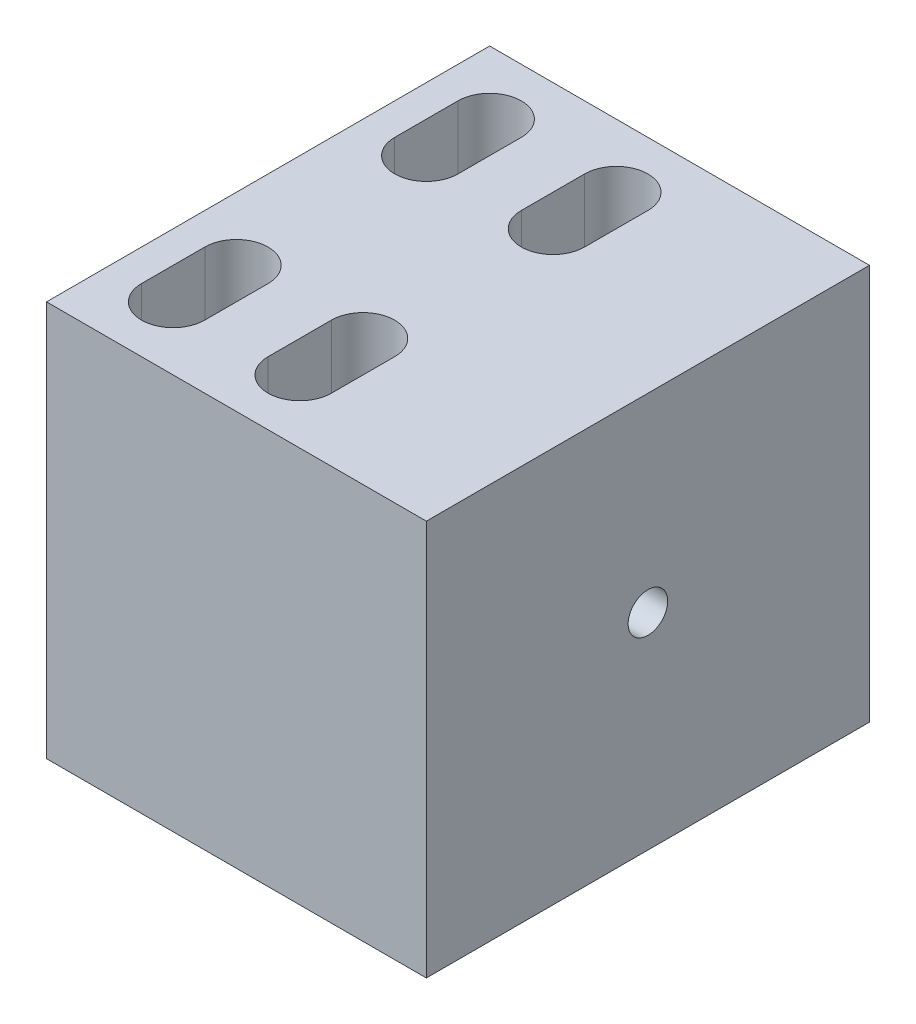
ISO-10303-21;
HEADER;
FILE_DESCRIPTION(('STEP AP214'),'2;1');
FILE_NAME('part.step','',(''),(''),'','','');
FILE_SCHEMA(('AUTOMOTIVE_DESIGN { 1 0 10303 214 1 1 1 1 }'));
ENDSEC;
DATA;
#1=APPLICATION_CONTEXT('core data for automotive mechanical design processes');
#2=APPLICATION_PROTOCOL_DEFINITION('international standard','automotive_design',2000,#1);
#3=PRODUCT_CONTEXT('',#1,'mechanical');
#4=PRODUCT('Part','Part','',(#3));
#5=PRODUCT_RELATED_PRODUCT_CATEGORY('part','',(#4));
#6=PRODUCT_DEFINITION_FORMATION('','',#4);
#7=PRODUCT_DEFINITION_CONTEXT('part definition',#1,'design');
#8=PRODUCT_DEFINITION('design','',#6,#7);
#9=PRODUCT_DEFINITION_SHAPE('','',#8);
#10=(LENGTH_UNIT() NAMED_UNIT(*) SI_UNIT(.MILLI.,.METRE.));
#11=(NAMED_UNIT(*) PLANE_ANGLE_UNIT() SI_UNIT($,.RADIAN.));
#12=(NAMED_UNIT(*) SI_UNIT($,.STERADIAN.) SOLID_ANGLE_UNIT());
#13=UNCERTAINTY_MEASURE_WITH_UNIT(LENGTH_MEASURE(1.E-05),#10,'distance_accuracy_value','');
#14=(GEOMETRIC_REPRESENTATION_CONTEXT(3) GLOBAL_UNCERTAINTY_ASSIGNED_CONTEXT((#13)) GLOBAL_UNIT_ASSIGNED_CONTEXT((#10,
#11,#12)) REPRESENTATION_CONTEXT('',''));
#15=CARTESIAN_POINT('',(0.,0.,0.));
#16=DIRECTION('',(0.,0.,1.));
#17=DIRECTION('',(1.,0.,0.));
#18=AXIS2_PLACEMENT_3D('',#15,#16,#17);
#19=CARTESIAN_POINT('',(0.,25.,0.));
#20=DIRECTION('',(-1.,0.,0.));
#21=DIRECTION('',(0.,0.,1.));
#22=AXIS2_PLACEMENT_3D('',#19,#20,#21);
#23=PLANE('',#22);
#24=CARTESIAN_POINT('',(0.,13.,-14.));
#25=DIRECTION('',(1.,0.,0.));
#26=DIRECTION('',(0.,0.,-1.));
#27=AXIS2_PLACEMENT_3D('',#24,#25,#26);
#28=CIRCLE('',#27,1.25);
#29=CARTESIAN_POINT('',(0.,13.,-15.25));
#30=VERTEX_POINT('',#29);
#31=EDGE_CURVE('E249',#30,#30,#28,.T.);
#32=ORIENTED_EDGE('',*,*,#31,.T.);
#33=EDGE_LOOP('',(#32));
#34=FACE_BOUND('',#33,.T.);
#35=DIRECTION('',(0.,0.,-1.));
#36=VECTOR('',#35,1.);
#37=CARTESIAN_POINT('',(0.,0.,0.));
#38=LINE('',#37,#36);
#39=CARTESIAN_POINT('',(0.,0.,0.));
#40=VERTEX_POINT('',#39);
#41=CARTESIAN_POINT('',(0.,0.,-28.));
#42=VERTEX_POINT('',#41);
#43=EDGE_CURVE('E295',#40,#42,#38,.T.);
#44=ORIENTED_EDGE('',*,*,#43,.F.);
#45=DIRECTION('',(0.,-1.,0.));
#46=VECTOR('',#45,1.);
#47=CARTESIAN_POINT('',(0.,25.,0.));
#48=LINE('',#47,#46);
#49=CARTESIAN_POINT('',(0.,25.,0.));
#50=VERTEX_POINT('',#49);
#51=EDGE_CURVE('E11',#50,#40,#48,.T.);
#52=ORIENTED_EDGE('',*,*,#51,.F.);
#53=DIRECTION('',(0.,0.,-1.));
#54=VECTOR('',#53,1.);
#55=CARTESIAN_POINT('',(0.,25.,0.));
#56=LINE('',#55,#54);
#57=CARTESIAN_POINT('',(0.,25.,-28.));
#58=VERTEX_POINT('',#57);
#59=EDGE_CURVE('E190',#50,#58,#56,.T.);
#60=ORIENTED_EDGE('',*,*,#59,.T.);
#61=DIRECTION('',(0.,-1.,0.));
#62=VECTOR('',#61,1.);
#63=CARTESIAN_POINT('',(0.,25.,-28.));
#64=LINE('',#63,#62);
#65=EDGE_CURVE('E52',#58,#42,#64,.T.);
#66=ORIENTED_EDGE('',*,*,#65,.T.);
#67=EDGE_LOOP('',(#44,#52,#60,#66));
#68=FACE_BOUND('',#67,.T.);
#69=ADVANCED_FACE('F33',(#34,#68),#23,.T.);
#70=CARTESIAN_POINT('',(0.,25.,0.));
#71=DIRECTION('',(0.,0.,-1.));
#72=DIRECTION('',(-1.,0.,0.));
#73=AXIS2_PLACEMENT_3D('',#70,#71,#72);
#74=PLANE('',#73);
#75=DIRECTION('',(1.,0.,0.));
#76=VECTOR('',#75,1.);
#77=CARTESIAN_POINT('',(0.,0.,0.));
#78=LINE('',#77,#76);
#79=CARTESIAN_POINT('',(24.,0.,0.));
#80=VERTEX_POINT('',#79);
#81=EDGE_CURVE('E195',#40,#80,#78,.T.);
#82=ORIENTED_EDGE('',*,*,#81,.T.);
#83=DIRECTION('',(0.,-1.,0.));
#84=VECTOR('',#83,1.);
#85=CARTESIAN_POINT('',(24.,25.,0.));
#86=LINE('',#85,#84);
#87=CARTESIAN_POINT('',(24.,25.,0.));
#88=VERTEX_POINT('',#87);
#89=EDGE_CURVE('E43',#88,#80,#86,.T.);
#90=ORIENTED_EDGE('',*,*,#89,.F.);
#91=DIRECTION('',(1.,0.,0.));
#92=VECTOR('',#91,1.);
#93=CARTESIAN_POINT('',(0.,25.,0.));
#94=LINE('',#93,#92);
#95=EDGE_CURVE('E185',#50,#88,#94,.T.);
#96=ORIENTED_EDGE('',*,*,#95,.F.);
#97=ORIENTED_EDGE('',*,*,#51,.T.);
#98=EDGE_LOOP('',(#82,#90,#96,#97));
#99=FACE_BOUND('',#98,.T.);
#100=ADVANCED_FACE('F193',(#99),#74,.F.);
#101=CARTESIAN_POINT('',(24.,25.,0.));
#102=DIRECTION('',(-1.,0.,0.));
#103=DIRECTION('',(0.,0.,1.));
#104=AXIS2_PLACEMENT_3D('',#101,#102,#103);
#105=PLANE('',#104);
#106=CARTESIAN_POINT('',(24.,13.,-14.));
#107=DIRECTION('',(1.,0.,0.));
#108=DIRECTION('',(0.,0.,-1.));
#109=AXIS2_PLACEMENT_3D('',#106,#107,#108);
#110=CIRCLE('',#109,1.25);
#111=CARTESIAN_POINT('',(24.,13.,-15.25));
#112=VERTEX_POINT('',#111);
#113=EDGE_CURVE('E252',#112,#112,#110,.T.);
#114=ORIENTED_EDGE('',*,*,#113,.F.);
#115=EDGE_LOOP('',(#114));
#116=FACE_BOUND('',#115,.T.);
#117=DIRECTION('',(0.,0.,-1.));
#118=VECTOR('',#117,1.);
#119=CARTESIAN_POINT('',(24.,0.,0.));
#120=LINE('',#119,#118);
#121=CARTESIAN_POINT('',(24.,0.,-28.));
#122=VERTEX_POINT('',#121);
#123=EDGE_CURVE('E298',#80,#122,#120,.T.);
#124=ORIENTED_EDGE('',*,*,#123,.T.);
#125=DIRECTION('',(0.,-1.,0.));
#126=VECTOR('',#125,1.);
#127=CARTESIAN_POINT('',(24.,25.,-28.));
#128=LINE('',#127,#126);
#129=CARTESIAN_POINT('',(24.,25.,-28.));
#130=VERTEX_POINT('',#129);
#131=EDGE_CURVE('E114',#130,#122,#128,.T.);
#132=ORIENTED_EDGE('',*,*,#131,.F.);
#133=DIRECTION('',(0.,0.,-1.));
#134=VECTOR('',#133,1.);
#135=CARTESIAN_POINT('',(24.,25.,0.));
#136=LINE('',#135,#134);
#137=EDGE_CURVE('E177',#88,#130,#136,.T.);
#138=ORIENTED_EDGE('',*,*,#137,.F.);
#139=ORIENTED_EDGE('',*,*,#89,.T.);
#140=EDGE_LOOP('',(#124,#132,#138,#139));
#141=FACE_BOUND('',#140,.T.);
#142=ADVANCED_FACE('F179',(#116,#141),#105,.F.);
#143=CARTESIAN_POINT('',(12.,25.,-8.));
#144=DIRECTION('',(0.,-1.,0.));
#145=DIRECTION('',(0.,0.,-1.));
#146=AXIS2_PLACEMENT_3D('',#143,#144,#145);
#147=CYLINDRICAL_SURFACE('',#146,2.);
#148=CARTESIAN_POINT('',(12.,0.,-8.));
#149=DIRECTION('',(0.,1.,0.));
#150=DIRECTION('',(0.,0.,1.));
#151=AXIS2_PLACEMENT_3D('',#148,#149,#150);
#152=CIRCLE('',#151,2.);
#153=CARTESIAN_POINT('',(14.,0.,-8.));
#154=VERTEX_POINT('',#153);
#155=CARTESIAN_POINT('',(10.,0.,-8.));
#156=VERTEX_POINT('',#155);
#157=EDGE_CURVE('E283',#154,#156,#152,.T.);
#158=ORIENTED_EDGE('',*,*,#157,.F.);
#159=DIRECTION('',(0.,-1.,0.));
#160=VECTOR('',#159,1.);
#161=CARTESIAN_POINT('',(14.,25.,-8.));
#162=LINE('',#161,#160);
#163=CARTESIAN_POINT('',(14.,25.,-8.));
#164=VERTEX_POINT('',#163);
#165=EDGE_CURVE('E207',#164,#154,#162,.T.);
#166=ORIENTED_EDGE('',*,*,#165,.F.);
#167=CARTESIAN_POINT('',(12.,25.,-8.));
#168=DIRECTION('',(0.,1.,0.));
#169=DIRECTION('',(0.,0.,1.));
#170=AXIS2_PLACEMENT_3D('',#167,#168,#169);
#171=CIRCLE('',#170,2.);
#172=CARTESIAN_POINT('',(10.,25.,-8.));
#173=VERTEX_POINT('',#172);
#174=EDGE_CURVE('E336',#164,#173,#171,.T.);
#175=ORIENTED_EDGE('',*,*,#174,.T.);
#176=DIRECTION('',(0.,-1.,0.));
#177=VECTOR('',#176,1.);
#178=CARTESIAN_POINT('',(10.,25.,-8.));
#179=LINE('',#178,#177);
#180=EDGE_CURVE('E200',#173,#156,#179,.T.);
#181=ORIENTED_EDGE('',*,*,#180,.T.);
#182=EDGE_LOOP('',(#158,#166,#175,#181));
#183=FACE_BOUND('',#182,.T.);
#184=ADVANCED_FACE('F384',(#183),#147,.F.);
#185=CARTESIAN_POINT('',(14.,25.,0.));
#186=DIRECTION('',(-1.,0.,0.));
#187=DIRECTION('',(0.,0.,1.));
#188=AXIS2_PLACEMENT_3D('',#185,#186,#187);
#189=PLANE('',#188);
#190=DIRECTION('',(0.,0.,-1.));
#191=VECTOR('',#190,1.);
#192=CARTESIAN_POINT('',(14.,0.,0.));
#193=LINE('',#192,#191);
#194=CARTESIAN_POINT('',(14.,0.,-4.));
#195=VERTEX_POINT('',#194);
#196=EDGE_CURVE('E286',#195,#154,#193,.T.);
#197=ORIENTED_EDGE('',*,*,#196,.F.);
#198=DIRECTION('',(0.,-1.,0.));
#199=VECTOR('',#198,1.);
#200=CARTESIAN_POINT('',(14.,25.,-4.));
#201=LINE('',#200,#199);
#202=CARTESIAN_POINT('',(14.,25.,-4.));
#203=VERTEX_POINT('',#202);
#204=EDGE_CURVE('E205',#203,#195,#201,.T.);
#205=ORIENTED_EDGE('',*,*,#204,.F.);
#206=DIRECTION('',(0.,0.,-1.));
#207=VECTOR('',#206,1.);
#208=CARTESIAN_POINT('',(14.,25.,0.));
#209=LINE('',#208,#207);
#210=EDGE_CURVE('E339',#203,#164,#209,.T.);
#211=ORIENTED_EDGE('',*,*,#210,.T.);
#212=ORIENTED_EDGE('',*,*,#165,.T.);
#213=EDGE_LOOP('',(#197,#205,#211,#212));
#214=FACE_BOUND('',#213,.T.);
#215=ADVANCED_FACE('F380',(#214),#189,.T.);
#216=CARTESIAN_POINT('',(12.,25.,-4.));
#217=DIRECTION('',(0.,-1.,0.));
#218=DIRECTION('',(0.,0.,-1.));
#219=AXIS2_PLACEMENT_3D('',#216,#217,#218);
#220=CYLINDRICAL_SURFACE('',#219,2.);
#221=CARTESIAN_POINT('',(12.,0.,-4.));
#222=DIRECTION('',(0.,1.,0.));
#223=DIRECTION('',(0.,0.,1.));
#224=AXIS2_PLACEMENT_3D('',#221,#222,#223);
#225=CIRCLE('',#224,2.);
#226=CARTESIAN_POINT('',(10.,0.,-4.));
#227=VERTEX_POINT('',#226);
#228=EDGE_CURVE('E289',#227,#195,#225,.T.);
#229=ORIENTED_EDGE('',*,*,#228,.F.);
#230=DIRECTION('',(0.,-1.,0.));
#231=VECTOR('',#230,1.);
#232=CARTESIAN_POINT('',(10.,25.,-4.));
#233=LINE('',#232,#231);
#234=CARTESIAN_POINT('',(10.,25.,-4.));
#235=VERTEX_POINT('',#234);
#236=EDGE_CURVE('E202',#235,#227,#233,.T.);
#237=ORIENTED_EDGE('',*,*,#236,.F.);
#238=CARTESIAN_POINT('',(12.,25.,-4.));
#239=DIRECTION('',(0.,1.,0.));
#240=DIRECTION('',(0.,0.,1.));
#241=AXIS2_PLACEMENT_3D('',#238,#239,#240);
#242=CIRCLE('',#241,2.);
#243=EDGE_CURVE('E342',#235,#203,#242,.T.);
#244=ORIENTED_EDGE('',*,*,#243,.T.);
#245=ORIENTED_EDGE('',*,*,#204,.T.);
#246=EDGE_LOOP('',(#229,#237,#244,#245));
#247=FACE_BOUND('',#246,.T.);
#248=ADVANCED_FACE('F376',(#247),#220,.F.);
#249=CARTESIAN_POINT('',(11.9999999999999,25.,-24.));
#250=DIRECTION('',(0.,-1.,0.));
#251=DIRECTION('',(0.,0.,-1.));
#252=AXIS2_PLACEMENT_3D('',#249,#250,#251);
#253=CYLINDRICAL_SURFACE('',#252,2.00000000000006);
#254=CARTESIAN_POINT('',(11.9999999999999,0.,-24.));
#255=DIRECTION('',(0.,1.,0.));
#256=DIRECTION('',(0.,0.,1.));
#257=AXIS2_PLACEMENT_3D('',#254,#255,#256);
#258=CIRCLE('',#257,2.00000000000006);
#259=CARTESIAN_POINT('',(14.0000000000001,0.,-24.));
#260=VERTEX_POINT('',#259);
#261=CARTESIAN_POINT('',(9.99999999999994,0.,-24.));
#262=VERTEX_POINT('',#261);
#263=EDGE_CURVE('E271',#260,#262,#258,.T.);
#264=ORIENTED_EDGE('',*,*,#263,.F.);
#265=DIRECTION('',(0.,-1.,0.));
#266=VECTOR('',#265,1.);
#267=CARTESIAN_POINT('',(14.0000000000001,25.,-24.));
#268=LINE('',#267,#266);
#269=CARTESIAN_POINT('',(14.0000000000001,25.,-24.));
#270=VERTEX_POINT('',#269);
#271=EDGE_CURVE('E203',#270,#260,#268,.T.);
#272=ORIENTED_EDGE('',*,*,#271,.F.);
#273=CARTESIAN_POINT('',(11.9999999999999,25.,-24.));
#274=DIRECTION('',(0.,1.,0.));
#275=DIRECTION('',(0.,0.,1.));
#276=AXIS2_PLACEMENT_3D('',#273,#274,#275);
#277=CIRCLE('',#276,2.00000000000006);
#278=CARTESIAN_POINT('',(9.99999999999994,25.,-24.));
#279=VERTEX_POINT('',#278);
#280=EDGE_CURVE('E325',#270,#279,#277,.T.);
#281=ORIENTED_EDGE('',*,*,#280,.T.);
#282=DIRECTION('',(0.,-1.,0.));
#283=VECTOR('',#282,1.);
#284=CARTESIAN_POINT('',(9.99999999999994,25.,-24.));
#285=LINE('',#284,#283);
#286=EDGE_CURVE('E209',#279,#262,#285,.T.);
#287=ORIENTED_EDGE('',*,*,#286,.T.);
#288=EDGE_LOOP('',(#264,#272,#281,#287));
#289=FACE_BOUND('',#288,.T.);
#290=ADVANCED_FACE('F379',(#289),#253,.F.);
#291=CARTESIAN_POINT('',(14.0000000000001,25.,0.));
#292=DIRECTION('',(-1.,0.,0.));
#293=DIRECTION('',(0.,0.,1.));
#294=AXIS2_PLACEMENT_3D('',#291,#292,#293);
#295=PLANE('',#294);
#296=DIRECTION('',(0.,0.,-1.));
#297=VECTOR('',#296,1.);
#298=CARTESIAN_POINT('',(14.0000000000001,0.,0.));
#299=LINE('',#298,#297);
#300=CARTESIAN_POINT('',(14.0000000000001,0.,-20.));
#301=VERTEX_POINT('',#300);
#302=EDGE_CURVE('E274',#301,#260,#299,.T.);
#303=ORIENTED_EDGE('',*,*,#302,.F.);
#304=DIRECTION('',(0.,-1.,0.));
#305=VECTOR('',#304,1.);
#306=CARTESIAN_POINT('',(14.0000000000001,25.,-20.));
#307=LINE('',#306,#305);
#308=CARTESIAN_POINT('',(14.0000000000001,25.,-20.));
#309=VERTEX_POINT('',#308);
#310=EDGE_CURVE('E214',#309,#301,#307,.T.);
#311=ORIENTED_EDGE('',*,*,#310,.F.);
#312=DIRECTION('',(0.,0.,-1.));
#313=VECTOR('',#312,1.);
#314=CARTESIAN_POINT('',(14.0000000000001,25.,0.));
#315=LINE('',#314,#313);
#316=EDGE_CURVE('E328',#309,#270,#315,.T.);
#317=ORIENTED_EDGE('',*,*,#316,.T.);
#318=ORIENTED_EDGE('',*,*,#271,.T.);
#319=EDGE_LOOP('',(#303,#311,#317,#318));
#320=FACE_BOUND('',#319,.T.);
#321=ADVANCED_FACE('F396',(#320),#295,.T.);
#322=CARTESIAN_POINT('',(11.9999999999999,25.,-20.));
#323=DIRECTION('',(0.,-1.,0.));
#324=DIRECTION('',(0.,0.,-1.));
#325=AXIS2_PLACEMENT_3D('',#322,#323,#324);
#326=CYLINDRICAL_SURFACE('',#325,2.00000000000006);
#327=CARTESIAN_POINT('',(11.9999999999999,0.,-20.));
#328=DIRECTION('',(0.,1.,0.));
#329=DIRECTION('',(0.,0.,1.));
#330=AXIS2_PLACEMENT_3D('',#327,#328,#329);
#331=CIRCLE('',#330,2.00000000000006);
#332=CARTESIAN_POINT('',(9.99999999999994,0.,-20.));
#333=VERTEX_POINT('',#332);
#334=EDGE_CURVE('E277',#333,#301,#331,.T.);
#335=ORIENTED_EDGE('',*,*,#334,.F.);
#336=DIRECTION('',(0.,-1.,0.));
#337=VECTOR('',#336,1.);
#338=CARTESIAN_POINT('',(9.99999999999994,25.,-20.));
#339=LINE('',#338,#337);
#340=CARTESIAN_POINT('',(9.99999999999994,25.,-20.));
#341=VERTEX_POINT('',#340);
#342=EDGE_CURVE('E211',#341,#333,#339,.T.);
#343=ORIENTED_EDGE('',*,*,#342,.F.);
#344=CARTESIAN_POINT('',(11.9999999999999,25.,-20.));
#345=DIRECTION('',(0.,1.,0.));
#346=DIRECTION('',(0.,0.,1.));
#347=AXIS2_PLACEMENT_3D('',#344,#345,#346);
#348=CIRCLE('',#347,2.00000000000006);
#349=EDGE_CURVE('E331',#341,#309,#348,.T.);
#350=ORIENTED_EDGE('',*,*,#349,.T.);
#351=ORIENTED_EDGE('',*,*,#310,.T.);
#352=EDGE_LOOP('',(#335,#343,#350,#351));
#353=FACE_BOUND('',#352,.T.);
#354=ADVANCED_FACE('F392',(#353),#326,.F.);
#355=CARTESIAN_POINT('',(3.99999999999994,25.,-24.));
#356=DIRECTION('',(0.,-1.,0.));
#357=DIRECTION('',(0.,0.,-1.));
#358=AXIS2_PLACEMENT_3D('',#355,#356,#357);
#359=CYLINDRICAL_SURFACE('',#358,2.00000000000006);
#360=CARTESIAN_POINT('',(3.99999999999994,0.,-24.));
#361=DIRECTION('',(0.,1.,0.));
#362=DIRECTION('',(0.,0.,1.));
#363=AXIS2_PLACEMENT_3D('',#360,#361,#362);
#364=CIRCLE('',#363,2.00000000000006);
#365=CARTESIAN_POINT('',(6.00000000000006,0.,-24.));
#366=VERTEX_POINT('',#365);
#367=CARTESIAN_POINT('',(1.99999999999994,0.,-24.));
#368=VERTEX_POINT('',#367);
#369=EDGE_CURVE('E259',#366,#368,#364,.T.);
#370=ORIENTED_EDGE('',*,*,#369,.F.);
#371=DIRECTION('',(0.,-1.,0.));
#372=VECTOR('',#371,1.);
#373=CARTESIAN_POINT('',(6.00000000000006,25.,-24.));
#374=LINE('',#373,#372);
#375=CARTESIAN_POINT('',(6.00000000000006,25.,-24.));
#376=VERTEX_POINT('',#375);
#377=EDGE_CURVE('E212',#376,#366,#374,.T.);
#378=ORIENTED_EDGE('',*,*,#377,.F.);
#379=CARTESIAN_POINT('',(3.99999999999994,25.,-24.));
#380=DIRECTION('',(0.,1.,0.));
#381=DIRECTION('',(0.,0.,1.));
#382=AXIS2_PLACEMENT_3D('',#379,#380,#381);
#383=CIRCLE('',#382,2.00000000000006);
#384=CARTESIAN_POINT('',(1.99999999999994,25.,-24.));
#385=VERTEX_POINT('',#384);
#386=EDGE_CURVE('E314',#376,#385,#383,.T.);
#387=ORIENTED_EDGE('',*,*,#386,.T.);
#388=DIRECTION('',(0.,-1.,0.));
#389=VECTOR('',#388,1.);
#390=CARTESIAN_POINT('',(1.99999999999994,25.,-24.));
#391=LINE('',#390,#389);
#392=EDGE_CURVE('E217',#385,#368,#391,.T.);
#393=ORIENTED_EDGE('',*,*,#392,.T.);
#394=EDGE_LOOP('',(#370,#378,#387,#393));
#395=FACE_BOUND('',#394,.T.);
#396=ADVANCED_FACE('F395',(#395),#359,.F.);
#397=CARTESIAN_POINT('',(6.00000000000006,25.,0.));
#398=DIRECTION('',(-1.,0.,0.));
#399=DIRECTION('',(0.,0.,1.));
#400=AXIS2_PLACEMENT_3D('',#397,#398,#399);
#401=PLANE('',#400);
#402=DIRECTION('',(0.,0.,-1.));
#403=VECTOR('',#402,1.);
#404=CARTESIAN_POINT('',(6.00000000000006,0.,0.));
#405=LINE('',#404,#403);
#406=CARTESIAN_POINT('',(6.00000000000006,0.,-20.));
#407=VERTEX_POINT('',#406);
#408=EDGE_CURVE('E262',#407,#366,#405,.T.);
#409=ORIENTED_EDGE('',*,*,#408,.F.);
#410=DIRECTION('',(0.,-1.,0.));
#411=VECTOR('',#410,1.);
#412=CARTESIAN_POINT('',(6.00000000000006,25.,-20.));
#413=LINE('',#412,#411);
#414=CARTESIAN_POINT('',(6.00000000000006,25.,-20.));
#415=VERTEX_POINT('',#414);
#416=EDGE_CURVE('E221',#415,#407,#413,.T.);
#417=ORIENTED_EDGE('',*,*,#416,.F.);
#418=DIRECTION('',(0.,0.,-1.));
#419=VECTOR('',#418,1.);
#420=CARTESIAN_POINT('',(6.00000000000006,25.,0.));
#421=LINE('',#420,#419);
#422=EDGE_CURVE('E317',#415,#376,#421,.T.);
#423=ORIENTED_EDGE('',*,*,#422,.T.);
#424=ORIENTED_EDGE('',*,*,#377,.T.);
#425=EDGE_LOOP('',(#409,#417,#423,#424));
#426=FACE_BOUND('',#425,.T.);
#427=ADVANCED_FACE('F410',(#426),#401,.T.);
#428=CARTESIAN_POINT('',(3.99999999999994,25.,-20.));
#429=DIRECTION('',(0.,-1.,0.));
#430=DIRECTION('',(0.,0.,-1.));
#431=AXIS2_PLACEMENT_3D('',#428,#429,#430);
#432=CYLINDRICAL_SURFACE('',#431,2.00000000000006);
#433=CARTESIAN_POINT('',(3.99999999999994,0.,-20.));
#434=DIRECTION('',(0.,1.,0.));
#435=DIRECTION('',(0.,0.,1.));
#436=AXIS2_PLACEMENT_3D('',#433,#434,#435);
#437=CIRCLE('',#436,2.00000000000006);
#438=CARTESIAN_POINT('',(1.99999999999994,0.,-20.));
#439=VERTEX_POINT('',#438);
#440=EDGE_CURVE('E265',#439,#407,#437,.T.);
#441=ORIENTED_EDGE('',*,*,#440,.F.);
#442=DIRECTION('',(0.,-1.,0.));
#443=VECTOR('',#442,1.);
#444=CARTESIAN_POINT('',(1.99999999999994,25.,-20.));
#445=LINE('',#444,#443);
#446=CARTESIAN_POINT('',(1.99999999999994,25.,-20.));
#447=VERTEX_POINT('',#446);
#448=EDGE_CURVE('E219',#447,#439,#445,.T.);
#449=ORIENTED_EDGE('',*,*,#448,.F.);
#450=CARTESIAN_POINT('',(3.99999999999994,25.,-20.));
#451=DIRECTION('',(0.,1.,0.));
#452=DIRECTION('',(0.,0.,1.));
#453=AXIS2_PLACEMENT_3D('',#450,#451,#452);
#454=CIRCLE('',#453,2.00000000000006);
#455=EDGE_CURVE('E320',#447,#415,#454,.T.);
#456=ORIENTED_EDGE('',*,*,#455,.T.);
#457=ORIENTED_EDGE('',*,*,#416,.T.);
#458=EDGE_LOOP('',(#441,#449,#456,#457));
#459=FACE_BOUND('',#458,.T.);
#460=ADVANCED_FACE('F407',(#459),#432,.F.);
#461=CARTESIAN_POINT('',(4.,25.,-4.));
#462=DIRECTION('',(0.,-1.,0.));
#463=DIRECTION('',(0.,0.,-1.));
#464=AXIS2_PLACEMENT_3D('',#461,#462,#463);
#465=CYLINDRICAL_SURFACE('',#464,2.);
#466=CARTESIAN_POINT('',(4.,0.,-4.));
#467=DIRECTION('',(0.,1.,0.));
#468=DIRECTION('',(0.,0.,1.));
#469=AXIS2_PLACEMENT_3D('',#466,#467,#468);
#470=CIRCLE('',#469,2.);
#471=CARTESIAN_POINT('',(2.,0.,-4.));
#472=VERTEX_POINT('',#471);
#473=CARTESIAN_POINT('',(6.,0.,-4.));
#474=VERTEX_POINT('',#473);
#475=EDGE_CURVE('E245',#472,#474,#470,.T.);
#476=ORIENTED_EDGE('',*,*,#475,.F.);
#477=DIRECTION('',(0.,-1.,0.));
#478=VECTOR('',#477,1.);
#479=CARTESIAN_POINT('',(2.,25.,-4.));
#480=LINE('',#479,#478);
#481=CARTESIAN_POINT('',(2.,25.,-4.));
#482=VERTEX_POINT('',#481);
#483=EDGE_CURVE('E37',#482,#472,#480,.T.);
#484=ORIENTED_EDGE('',*,*,#483,.F.);
#485=CARTESIAN_POINT('',(4.,25.,-4.));
#486=DIRECTION('',(0.,1.,0.));
#487=DIRECTION('',(0.,0.,1.));
#488=AXIS2_PLACEMENT_3D('',#485,#486,#487);
#489=CIRCLE('',#488,2.);
#490=CARTESIAN_POINT('',(6.,25.,-4.));
#491=VERTEX_POINT('',#490);
#492=EDGE_CURVE('E302',#482,#491,#489,.T.);
#493=ORIENTED_EDGE('',*,*,#492,.T.);
#494=DIRECTION('',(0.,-1.,0.));
#495=VECTOR('',#494,1.);
#496=CARTESIAN_POINT('',(6.,25.,-4.));
#497=LINE('',#496,#495);
#498=EDGE_CURVE('E224',#491,#474,#497,.T.);
#499=ORIENTED_EDGE('',*,*,#498,.T.);
#500=EDGE_LOOP('',(#476,#484,#493,#499));
#501=FACE_BOUND('',#500,.T.);
#502=ADVANCED_FACE('F35',(#501),#465,.F.);
#503=CARTESIAN_POINT('',(2.,25.,0.));
#504=DIRECTION('',(-1.,0.,0.));
#505=DIRECTION('',(0.,0.,1.));
#506=AXIS2_PLACEMENT_3D('',#503,#504,#505);
#507=PLANE('',#506);
#508=DIRECTION('',(0.,0.,-1.));
#509=VECTOR('',#508,1.);
#510=CARTESIAN_POINT('',(2.,0.,0.));
#511=LINE('',#510,#509);
#512=CARTESIAN_POINT('',(2.,0.,-8.));
#513=VERTEX_POINT('',#512);
#514=EDGE_CURVE('E236',#472,#513,#511,.T.);
#515=ORIENTED_EDGE('',*,*,#514,.T.);
#516=DIRECTION('',(0.,-1.,0.));
#517=VECTOR('',#516,1.);
#518=CARTESIAN_POINT('',(2.,25.,-8.));
#519=LINE('',#518,#517);
#520=CARTESIAN_POINT('',(2.,25.,-8.));
#521=VERTEX_POINT('',#520);
#522=EDGE_CURVE('E227',#521,#513,#519,.T.);
#523=ORIENTED_EDGE('',*,*,#522,.F.);
#524=DIRECTION('',(0.,0.,-1.));
#525=VECTOR('',#524,1.);
#526=CARTESIAN_POINT('',(2.,25.,0.));
#527=LINE('',#526,#525);
#528=EDGE_CURVE('E238',#482,#521,#527,.T.);
#529=ORIENTED_EDGE('',*,*,#528,.F.);
#530=ORIENTED_EDGE('',*,*,#483,.T.);
#531=EDGE_LOOP('',(#515,#523,#529,#530));
#532=FACE_BOUND('',#531,.T.);
#533=ADVANCED_FACE('F235',(#532),#507,.F.);
#534=CARTESIAN_POINT('',(4.,25.,-8.));
#535=DIRECTION('',(0.,-1.,0.));
#536=DIRECTION('',(0.,0.,-1.));
#537=AXIS2_PLACEMENT_3D('',#534,#535,#536);
#538=CYLINDRICAL_SURFACE('',#537,2.);
#539=CARTESIAN_POINT('',(4.,0.,-8.));
#540=DIRECTION('',(0.,1.,0.));
#541=DIRECTION('',(0.,0.,1.));
#542=AXIS2_PLACEMENT_3D('',#539,#540,#541);
#543=CIRCLE('',#542,2.);
#544=CARTESIAN_POINT('',(6.,0.,-8.));
#545=VERTEX_POINT('',#544);
#546=EDGE_CURVE('E247',#545,#513,#543,.T.);
#547=ORIENTED_EDGE('',*,*,#546,.F.);
#548=DIRECTION('',(0.,-1.,0.));
#549=VECTOR('',#548,1.);
#550=CARTESIAN_POINT('',(6.,25.,-8.));
#551=LINE('',#550,#549);
#552=CARTESIAN_POINT('',(6.,25.,-8.));
#553=VERTEX_POINT('',#552);
#554=EDGE_CURVE('E226',#553,#545,#551,.T.);
#555=ORIENTED_EDGE('',*,*,#554,.F.);
#556=CARTESIAN_POINT('',(4.,25.,-8.));
#557=DIRECTION('',(0.,1.,0.));
#558=DIRECTION('',(0.,0.,1.));
#559=AXIS2_PLACEMENT_3D('',#556,#557,#558);
#560=CIRCLE('',#559,2.);
#561=EDGE_CURVE('E306',#553,#521,#560,.T.);
#562=ORIENTED_EDGE('',*,*,#561,.T.);
#563=ORIENTED_EDGE('',*,*,#522,.T.);
#564=EDGE_LOOP('',(#547,#555,#562,#563));
#565=FACE_BOUND('',#564,.T.);
#566=ADVANCED_FACE('F374',(#565),#538,.F.);
#567=CARTESIAN_POINT('',(10.,25.,0.));
#568=DIRECTION('',(-1.,0.,0.));
#569=DIRECTION('',(0.,0.,1.));
#570=AXIS2_PLACEMENT_3D('',#567,#568,#569);
#571=PLANE('',#570);
#572=DIRECTION('',(0.,0.,-1.));
#573=VECTOR('',#572,1.);
#574=CARTESIAN_POINT('',(10.,0.,0.));
#575=LINE('',#574,#573);
#576=EDGE_CURVE('E292',#227,#156,#575,.T.);
#577=ORIENTED_EDGE('',*,*,#576,.T.);
#578=ORIENTED_EDGE('',*,*,#180,.F.);
#579=DIRECTION('',(0.,0.,-1.));
#580=VECTOR('',#579,1.);
#581=CARTESIAN_POINT('',(10.,25.,0.));
#582=LINE('',#581,#580);
#583=EDGE_CURVE('E345',#235,#173,#582,.T.);
#584=ORIENTED_EDGE('',*,*,#583,.F.);
#585=ORIENTED_EDGE('',*,*,#236,.T.);
#586=EDGE_LOOP('',(#577,#578,#584,#585));
#587=FACE_BOUND('',#586,.T.);
#588=ADVANCED_FACE('F370',(#587),#571,.F.);
#589=CARTESIAN_POINT('',(9.99999999999994,25.,0.));
#590=DIRECTION('',(-1.,0.,0.));
#591=DIRECTION('',(0.,0.,1.));
#592=AXIS2_PLACEMENT_3D('',#589,#590,#591);
#593=PLANE('',#592);
#594=DIRECTION('',(0.,0.,-1.));
#595=VECTOR('',#594,1.);
#596=CARTESIAN_POINT('',(9.99999999999994,0.,0.));
#597=LINE('',#596,#595);
#598=EDGE_CURVE('E280',#333,#262,#597,.T.);
#599=ORIENTED_EDGE('',*,*,#598,.T.);
#600=ORIENTED_EDGE('',*,*,#286,.F.);
#601=DIRECTION('',(0.,0.,-1.));
#602=VECTOR('',#601,1.);
#603=CARTESIAN_POINT('',(9.99999999999994,25.,0.));
#604=LINE('',#603,#602);
#605=EDGE_CURVE('E334',#341,#279,#604,.T.);
#606=ORIENTED_EDGE('',*,*,#605,.F.);
#607=ORIENTED_EDGE('',*,*,#342,.T.);
#608=EDGE_LOOP('',(#599,#600,#606,#607));
#609=FACE_BOUND('',#608,.T.);
#610=ADVANCED_FACE('F373',(#609),#593,.F.);
#611=CARTESIAN_POINT('',(1.99999999999994,25.,0.));
#612=DIRECTION('',(-1.,0.,0.));
#613=DIRECTION('',(0.,0.,1.));
#614=AXIS2_PLACEMENT_3D('',#611,#612,#613);
#615=PLANE('',#614);
#616=DIRECTION('',(0.,0.,-1.));
#617=VECTOR('',#616,1.);
#618=CARTESIAN_POINT('',(1.99999999999994,0.,0.));
#619=LINE('',#618,#617);
#620=EDGE_CURVE('E268',#439,#368,#619,.T.);
#621=ORIENTED_EDGE('',*,*,#620,.T.);
#622=ORIENTED_EDGE('',*,*,#392,.F.);
#623=DIRECTION('',(0.,0.,-1.));
#624=VECTOR('',#623,1.);
#625=CARTESIAN_POINT('',(1.99999999999994,25.,0.));
#626=LINE('',#625,#624);
#627=EDGE_CURVE('E323',#447,#385,#626,.T.);
#628=ORIENTED_EDGE('',*,*,#627,.F.);
#629=ORIENTED_EDGE('',*,*,#448,.T.);
#630=EDGE_LOOP('',(#621,#622,#628,#629));
#631=FACE_BOUND('',#630,.T.);
#632=ADVANCED_FACE('F357',(#631),#615,.F.);
#633=CARTESIAN_POINT('',(6.,25.,0.));
#634=DIRECTION('',(-1.,0.,0.));
#635=DIRECTION('',(0.,0.,1.));
#636=AXIS2_PLACEMENT_3D('',#633,#634,#635);
#637=PLANE('',#636);
#638=DIRECTION('',(0.,0.,-1.));
#639=VECTOR('',#638,1.);
#640=CARTESIAN_POINT('',(6.,0.,0.));
#641=LINE('',#640,#639);
#642=EDGE_CURVE('E257',#474,#545,#641,.T.);
#643=ORIENTED_EDGE('',*,*,#642,.F.);
#644=ORIENTED_EDGE('',*,*,#498,.F.);
#645=DIRECTION('',(0.,0.,-1.));
#646=VECTOR('',#645,1.);
#647=CARTESIAN_POINT('',(6.,25.,0.));
#648=LINE('',#647,#646);
#649=EDGE_CURVE('E311',#491,#553,#648,.T.);
#650=ORIENTED_EDGE('',*,*,#649,.T.);
#651=ORIENTED_EDGE('',*,*,#554,.T.);
#652=EDGE_LOOP('',(#643,#644,#650,#651));
#653=FACE_BOUND('',#652,.T.);
#654=ADVANCED_FACE('F349',(#653),#637,.T.);
#655=CARTESIAN_POINT('',(0.,25.,-28.));
#656=DIRECTION('',(0.,0.,-1.));
#657=DIRECTION('',(-1.,0.,0.));
#658=AXIS2_PLACEMENT_3D('',#655,#656,#657);
#659=PLANE('',#658);
#660=DIRECTION('',(1.,0.,0.));
#661=VECTOR('',#660,1.);
#662=CARTESIAN_POINT('',(0.,0.,-28.));
#663=LINE('',#662,#661);
#664=EDGE_CURVE('E300',#42,#122,#663,.T.);
#665=ORIENTED_EDGE('',*,*,#664,.F.);
#666=ORIENTED_EDGE('',*,*,#65,.F.);
#667=DIRECTION('',(1.,0.,0.));
#668=VECTOR('',#667,1.);
#669=CARTESIAN_POINT('',(0.,25.,-28.));
#670=LINE('',#669,#668);
#671=EDGE_CURVE('E184',#58,#130,#670,.T.);
#672=ORIENTED_EDGE('',*,*,#671,.T.);
#673=ORIENTED_EDGE('',*,*,#131,.T.);
#674=EDGE_LOOP('',(#665,#666,#672,#673));
#675=FACE_BOUND('',#674,.T.);
#676=ADVANCED_FACE('F347',(#675),#659,.T.);
#677=CARTESIAN_POINT('',(0.,25.,0.));
#678=DIRECTION('',(0.,1.,0.));
#679=DIRECTION('',(0.,0.,1.));
#680=AXIS2_PLACEMENT_3D('',#677,#678,#679);
#681=PLANE('',#680);
#682=ORIENTED_EDGE('',*,*,#492,.F.);
#683=ORIENTED_EDGE('',*,*,#528,.T.);
#684=ORIENTED_EDGE('',*,*,#561,.F.);
#685=ORIENTED_EDGE('',*,*,#649,.F.);
#686=EDGE_LOOP('',(#682,#683,#684,#685));
#687=FACE_BOUND('',#686,.T.);
#688=ORIENTED_EDGE('',*,*,#386,.F.);
#689=ORIENTED_EDGE('',*,*,#422,.F.);
#690=ORIENTED_EDGE('',*,*,#455,.F.);
#691=ORIENTED_EDGE('',*,*,#627,.T.);
#692=EDGE_LOOP('',(#688,#689,#690,#691));
#693=FACE_BOUND('',#692,.T.);
#694=ORIENTED_EDGE('',*,*,#280,.F.);
#695=ORIENTED_EDGE('',*,*,#316,.F.);
#696=ORIENTED_EDGE('',*,*,#349,.F.);
#697=ORIENTED_EDGE('',*,*,#605,.T.);
#698=EDGE_LOOP('',(#694,#695,#696,#697));
#699=FACE_BOUND('',#698,.T.);
#700=ORIENTED_EDGE('',*,*,#174,.F.);
#701=ORIENTED_EDGE('',*,*,#210,.F.);
#702=ORIENTED_EDGE('',*,*,#243,.F.);
#703=ORIENTED_EDGE('',*,*,#583,.T.);
#704=EDGE_LOOP('',(#700,#701,#702,#703));
#705=FACE_BOUND('',#704,.T.);
#706=ORIENTED_EDGE('',*,*,#59,.F.);
#707=ORIENTED_EDGE('',*,*,#95,.T.);
#708=ORIENTED_EDGE('',*,*,#137,.T.);
#709=ORIENTED_EDGE('',*,*,#671,.F.);
#710=EDGE_LOOP('',(#706,#707,#708,#709));
#711=FACE_BOUND('',#710,.T.);
#712=ADVANCED_FACE('F189',(#687,#693,#699,#705,#711),#681,.T.);
#713=CARTESIAN_POINT('',(0.,0.,0.));
#714=DIRECTION('',(0.,1.,0.));
#715=DIRECTION('',(0.,0.,1.));
#716=AXIS2_PLACEMENT_3D('',#713,#714,#715);
#717=PLANE('',#716);
#718=ORIENTED_EDGE('',*,*,#475,.T.);
#719=ORIENTED_EDGE('',*,*,#642,.T.);
#720=ORIENTED_EDGE('',*,*,#546,.T.);
#721=ORIENTED_EDGE('',*,*,#514,.F.);
#722=EDGE_LOOP('',(#718,#719,#720,#721));
#723=FACE_BOUND('',#722,.T.);
#724=ORIENTED_EDGE('',*,*,#369,.T.);
#725=ORIENTED_EDGE('',*,*,#620,.F.);
#726=ORIENTED_EDGE('',*,*,#440,.T.);
#727=ORIENTED_EDGE('',*,*,#408,.T.);
#728=EDGE_LOOP('',(#724,#725,#726,#727));
#729=FACE_BOUND('',#728,.T.);
#730=ORIENTED_EDGE('',*,*,#263,.T.);
#731=ORIENTED_EDGE('',*,*,#598,.F.);
#732=ORIENTED_EDGE('',*,*,#334,.T.);
#733=ORIENTED_EDGE('',*,*,#302,.T.);
#734=EDGE_LOOP('',(#730,#731,#732,#733));
#735=FACE_BOUND('',#734,.T.);
#736=ORIENTED_EDGE('',*,*,#157,.T.);
#737=ORIENTED_EDGE('',*,*,#576,.F.);
#738=ORIENTED_EDGE('',*,*,#228,.T.);
#739=ORIENTED_EDGE('',*,*,#196,.T.);
#740=EDGE_LOOP('',(#736,#737,#738,#739));
#741=FACE_BOUND('',#740,.T.);
#742=ORIENTED_EDGE('',*,*,#43,.T.);
#743=ORIENTED_EDGE('',*,*,#664,.T.);
#744=ORIENTED_EDGE('',*,*,#123,.F.);
#745=ORIENTED_EDGE('',*,*,#81,.F.);
#746=EDGE_LOOP('',(#742,#743,#744,#745));
#747=FACE_BOUND('',#746,.T.);
#748=ADVANCED_FACE('F242',(#723,#729,#735,#741,#747),#717,.F.);
#749=CARTESIAN_POINT('',(0.,13.,-14.));
#750=DIRECTION('',(1.,0.,0.));
#751=DIRECTION('',(0.,0.,-1.));
#752=AXIS2_PLACEMENT_3D('',#749,#750,#751);
#753=CYLINDRICAL_SURFACE('',#752,1.25);
#754=ORIENTED_EDGE('',*,*,#31,.F.);
#755=EDGE_LOOP('',(#754));
#756=FACE_BOUND('',#755,.T.);
#757=ORIENTED_EDGE('',*,*,#113,.T.);
#758=EDGE_LOOP('',(#757));
#759=FACE_BOUND('',#758,.T.);
#760=ADVANCED_FACE('F545',(#756,#759),#753,.F.);
#761=CLOSED_SHELL('',(#69,#100,#142,#184,#215,#248,#290,#321,#354,#396,#427,#460,#502,#533,#566,
#588,#610,#632,#654,#676,#712,#748,#760));
#762=MANIFOLD_SOLID_BREP('B2',#761);
#763=ADVANCED_BREP_SHAPE_REPRESENTATION('',(#18,#762),#14);
#764=SHAPE_DEFINITION_REPRESENTATION(#9,#763);
ENDSEC;
END-ISO-10303-21;
